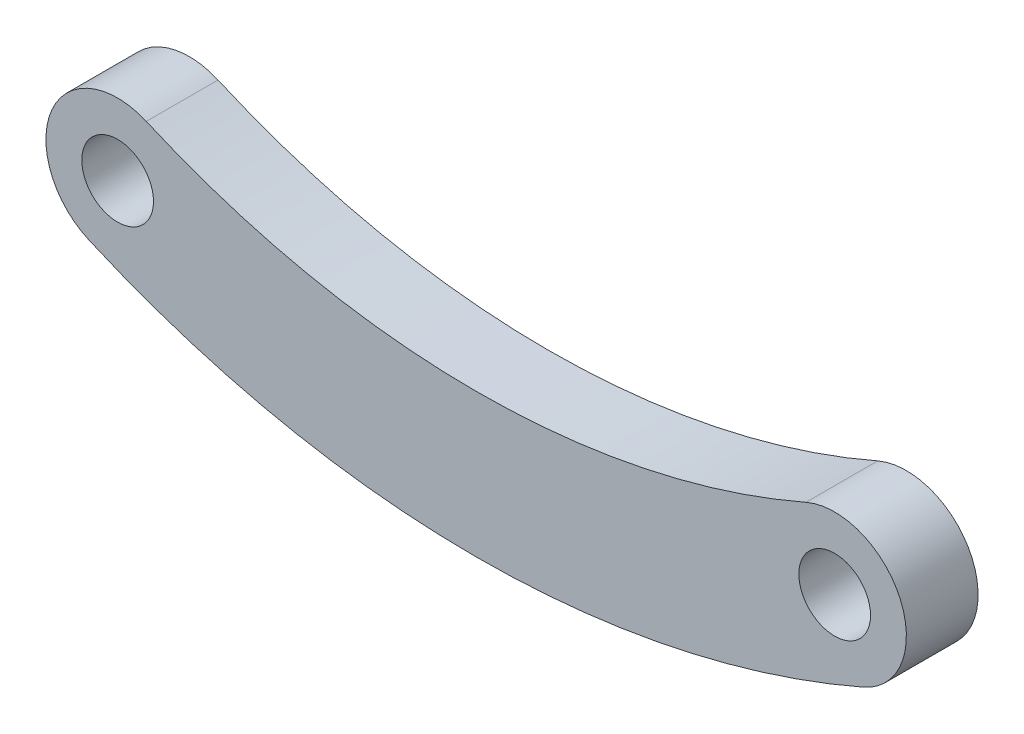
ISO-10303-21;
HEADER;
FILE_DESCRIPTION(('STEP AP214'),'2;1');
FILE_NAME('part.step','',(''),(''),'','','');
FILE_SCHEMA(('AUTOMOTIVE_DESIGN { 1 0 10303 214 1 1 1 1 }'));
ENDSEC;
DATA;
#1=APPLICATION_CONTEXT('core data for automotive mechanical design processes');
#2=APPLICATION_PROTOCOL_DEFINITION('international standard','automotive_design',2000,#1);
#3=PRODUCT_CONTEXT('',#1,'mechanical');
#4=PRODUCT('Part','Part','',(#3));
#5=PRODUCT_RELATED_PRODUCT_CATEGORY('part','',(#4));
#6=PRODUCT_DEFINITION_FORMATION('','',#4);
#7=PRODUCT_DEFINITION_CONTEXT('part definition',#1,'design');
#8=PRODUCT_DEFINITION('design','',#6,#7);
#9=PRODUCT_DEFINITION_SHAPE('','',#8);
#10=(LENGTH_UNIT() NAMED_UNIT(*) SI_UNIT(.MILLI.,.METRE.));
#11=(NAMED_UNIT(*) PLANE_ANGLE_UNIT() SI_UNIT($,.RADIAN.));
#12=(NAMED_UNIT(*) SI_UNIT($,.STERADIAN.) SOLID_ANGLE_UNIT());
#13=UNCERTAINTY_MEASURE_WITH_UNIT(LENGTH_MEASURE(1.E-05),#10,'distance_accuracy_value','');
#14=(GEOMETRIC_REPRESENTATION_CONTEXT(3) GLOBAL_UNCERTAINTY_ASSIGNED_CONTEXT((#13)) GLOBAL_UNIT_ASSIGNED_CONTEXT((#10,
#11,#12)) REPRESENTATION_CONTEXT('',''));
#15=CARTESIAN_POINT('',(0.,0.,0.));
#16=DIRECTION('',(0.,0.,1.));
#17=DIRECTION('',(1.,0.,0.));
#18=AXIS2_PLACEMENT_3D('',#15,#16,#17);
#19=CARTESIAN_POINT('',(10.0000000000001,22.9128784747793,4.));
#20=DIRECTION('',(0.,0.,-1.));
#21=DIRECTION('',(-1.,0.,0.));
#22=AXIS2_PLACEMENT_3D('',#19,#20,#21);
#23=PLANE('',#22);
#24=CARTESIAN_POINT('',(1.18123826692296E-13,2.4421653935236E-13,4.));
#25=DIRECTION('',(0.,0.,1.));
#26=DIRECTION('',(-1.,0.,0.));
#27=AXIS2_PLACEMENT_3D('',#24,#25,#26);
#28=CIRCLE('',#27,4.);
#29=CARTESIAN_POINT('',(1.59999999999996,3.66606055596469,4.));
#30=VERTEX_POINT('',#29);
#31=CARTESIAN_POINT('',(-1.60000000000001,-3.66606055596468,4.));
#32=VERTEX_POINT('',#31);
#33=EDGE_CURVE('E85',#30,#32,#28,.T.);
#34=ORIENTED_EDGE('',*,*,#33,.T.);
#35=CARTESIAN_POINT('',(20.,45.8257569495584,4.));
#36=DIRECTION('',(0.,0.,1.));
#37=DIRECTION('',(1.,0.,0.));
#38=AXIS2_PLACEMENT_3D('',#35,#36,#37);
#39=CIRCLE('',#38,54.);
#40=CARTESIAN_POINT('',(41.6,-3.66606055596468,4.));
#41=VERTEX_POINT('',#40);
#42=EDGE_CURVE('E80',#32,#41,#39,.T.);
#43=ORIENTED_EDGE('',*,*,#42,.T.);
#44=CARTESIAN_POINT('',(40.,0.,4.));
#45=DIRECTION('',(0.,0.,1.));
#46=DIRECTION('',(1.,0.,0.));
#47=AXIS2_PLACEMENT_3D('',#44,#45,#46);
#48=CIRCLE('',#47,4.00000000000001);
#49=CARTESIAN_POINT('',(38.4,3.66606055596467,4.));
#50=VERTEX_POINT('',#49);
#51=EDGE_CURVE('E83',#41,#50,#48,.T.);
#52=ORIENTED_EDGE('',*,*,#51,.T.);
#53=CARTESIAN_POINT('',(20.,45.8257569495584,4.));
#54=DIRECTION('',(0.,0.,-1.));
#55=DIRECTION('',(1.,0.,0.));
#56=AXIS2_PLACEMENT_3D('',#53,#54,#55);
#57=CIRCLE('',#56,46.);
#58=EDGE_CURVE('E50',#50,#30,#57,.T.);
#59=ORIENTED_EDGE('',*,*,#58,.T.);
#60=EDGE_LOOP('',(#34,#43,#52,#59));
#61=FACE_BOUND('',#60,.T.);
#62=CARTESIAN_POINT('',(0.,0.,4.));
#63=DIRECTION('',(0.,0.,1.));
#64=DIRECTION('',(1.,0.,0.));
#65=AXIS2_PLACEMENT_3D('',#62,#63,#64);
#66=CIRCLE('',#65,2.);
#67=CARTESIAN_POINT('',(2.,0.,4.));
#68=VERTEX_POINT('',#67);
#69=EDGE_CURVE('E100',#68,#68,#66,.T.);
#70=ORIENTED_EDGE('',*,*,#69,.F.);
#71=EDGE_LOOP('',(#70));
#72=FACE_BOUND('',#71,.T.);
#73=CARTESIAN_POINT('',(40.,0.,4.));
#74=DIRECTION('',(0.,0.,1.));
#75=DIRECTION('',(1.,0.,0.));
#76=AXIS2_PLACEMENT_3D('',#73,#74,#75);
#77=CIRCLE('',#76,2.);
#78=CARTESIAN_POINT('',(42.,0.,4.));
#79=VERTEX_POINT('',#78);
#80=EDGE_CURVE('E115',#79,#79,#77,.T.);
#81=ORIENTED_EDGE('',*,*,#80,.F.);
#82=EDGE_LOOP('',(#81));
#83=FACE_BOUND('',#82,.T.);
#84=ADVANCED_FACE('F33',(#61,#72,#83),#23,.F.);
#85=CARTESIAN_POINT('',(10.0000000000001,22.9128784747793,0.));
#86=DIRECTION('',(0.,0.,-1.));
#87=DIRECTION('',(-1.,0.,0.));
#88=AXIS2_PLACEMENT_3D('',#85,#86,#87);
#89=PLANE('',#88);
#90=CARTESIAN_POINT('',(0.,0.,0.));
#91=DIRECTION('',(0.,0.,1.));
#92=DIRECTION('',(1.,0.,0.));
#93=AXIS2_PLACEMENT_3D('',#90,#91,#92);
#94=CIRCLE('',#93,2.);
#95=CARTESIAN_POINT('',(2.,0.,0.));
#96=VERTEX_POINT('',#95);
#97=EDGE_CURVE('E112',#96,#96,#94,.T.);
#98=ORIENTED_EDGE('',*,*,#97,.T.);
#99=EDGE_LOOP('',(#98));
#100=FACE_BOUND('',#99,.T.);
#101=CARTESIAN_POINT('',(1.18123826692296E-13,2.4421653935236E-13,0.));
#102=DIRECTION('',(0.,0.,1.));
#103=DIRECTION('',(-1.,0.,0.));
#104=AXIS2_PLACEMENT_3D('',#101,#102,#103);
#105=CIRCLE('',#104,4.);
#106=CARTESIAN_POINT('',(1.59999999999996,3.66606055596469,0.));
#107=VERTEX_POINT('',#106);
#108=CARTESIAN_POINT('',(-1.60000000000001,-3.66606055596468,0.));
#109=VERTEX_POINT('',#108);
#110=EDGE_CURVE('E97',#107,#109,#105,.T.);
#111=ORIENTED_EDGE('',*,*,#110,.F.);
#112=CARTESIAN_POINT('',(20.,45.8257569495584,0.));
#113=DIRECTION('',(0.,0.,-1.));
#114=DIRECTION('',(1.,0.,0.));
#115=AXIS2_PLACEMENT_3D('',#112,#113,#114);
#116=CIRCLE('',#115,46.);
#117=CARTESIAN_POINT('',(38.4,3.66606055596467,0.));
#118=VERTEX_POINT('',#117);
#119=EDGE_CURVE('E73',#118,#107,#116,.T.);
#120=ORIENTED_EDGE('',*,*,#119,.F.);
#121=CARTESIAN_POINT('',(40.,0.,0.));
#122=DIRECTION('',(0.,0.,1.));
#123=DIRECTION('',(1.,0.,0.));
#124=AXIS2_PLACEMENT_3D('',#121,#122,#123);
#125=CIRCLE('',#124,4.00000000000001);
#126=CARTESIAN_POINT('',(41.6,-3.66606055596468,0.));
#127=VERTEX_POINT('',#126);
#128=EDGE_CURVE('E67',#127,#118,#125,.T.);
#129=ORIENTED_EDGE('',*,*,#128,.F.);
#130=CARTESIAN_POINT('',(20.,45.8257569495584,0.));
#131=DIRECTION('',(0.,0.,1.));
#132=DIRECTION('',(1.,0.,0.));
#133=AXIS2_PLACEMENT_3D('',#130,#131,#132);
#134=CIRCLE('',#133,54.);
#135=EDGE_CURVE('E89',#109,#127,#134,.T.);
#136=ORIENTED_EDGE('',*,*,#135,.F.);
#137=EDGE_LOOP('',(#111,#120,#129,#136));
#138=FACE_BOUND('',#137,.T.);
#139=CARTESIAN_POINT('',(40.,0.,0.));
#140=DIRECTION('',(0.,0.,1.));
#141=DIRECTION('',(1.,0.,0.));
#142=AXIS2_PLACEMENT_3D('',#139,#140,#141);
#143=CIRCLE('',#142,2.);
#144=CARTESIAN_POINT('',(42.,0.,0.));
#145=VERTEX_POINT('',#144);
#146=EDGE_CURVE('E118',#145,#145,#143,.T.);
#147=ORIENTED_EDGE('',*,*,#146,.T.);
#148=EDGE_LOOP('',(#147));
#149=FACE_BOUND('',#148,.T.);
#150=ADVANCED_FACE('F108',(#100,#138,#149),#89,.T.);
#151=CARTESIAN_POINT('',(1.18123826692296E-13,2.4421653935236E-13,4.));
#152=DIRECTION('',(0.,0.,-1.));
#153=DIRECTION('',(-1.,0.,0.));
#154=AXIS2_PLACEMENT_3D('',#151,#152,#153);
#155=CYLINDRICAL_SURFACE('',#154,4.);
#156=ORIENTED_EDGE('',*,*,#110,.T.);
#157=DIRECTION('',(0.,0.,-1.));
#158=VECTOR('',#157,1.);
#159=CARTESIAN_POINT('',(-1.60000000000001,-3.66606055596468,4.));
#160=LINE('',#159,#158);
#161=EDGE_CURVE('E11',#32,#109,#160,.T.);
#162=ORIENTED_EDGE('',*,*,#161,.F.);
#163=ORIENTED_EDGE('',*,*,#33,.F.);
#164=DIRECTION('',(0.,0.,-1.));
#165=VECTOR('',#164,1.);
#166=CARTESIAN_POINT('',(1.59999999999996,3.66606055596469,4.));
#167=LINE('',#166,#165);
#168=EDGE_CURVE('E93',#30,#107,#167,.T.);
#169=ORIENTED_EDGE('',*,*,#168,.T.);
#170=EDGE_LOOP('',(#156,#162,#163,#169));
#171=FACE_BOUND('',#170,.T.);
#172=ADVANCED_FACE('F35',(#171),#155,.T.);
#173=CARTESIAN_POINT('',(20.,45.8257569495584,4.));
#174=DIRECTION('',(0.,0.,-1.));
#175=DIRECTION('',(-1.,0.,0.));
#176=AXIS2_PLACEMENT_3D('',#173,#174,#175);
#177=CYLINDRICAL_SURFACE('',#176,54.);
#178=ORIENTED_EDGE('',*,*,#135,.T.);
#179=DIRECTION('',(0.,0.,-1.));
#180=VECTOR('',#179,1.);
#181=CARTESIAN_POINT('',(41.6,-3.66606055596468,4.));
#182=LINE('',#181,#180);
#183=EDGE_CURVE('E42',#41,#127,#182,.T.);
#184=ORIENTED_EDGE('',*,*,#183,.F.);
#185=ORIENTED_EDGE('',*,*,#42,.F.);
#186=ORIENTED_EDGE('',*,*,#161,.T.);
#187=EDGE_LOOP('',(#178,#184,#185,#186));
#188=FACE_BOUND('',#187,.T.);
#189=ADVANCED_FACE('F88',(#188),#177,.T.);
#190=CARTESIAN_POINT('',(40.,0.,4.));
#191=DIRECTION('',(0.,0.,-1.));
#192=DIRECTION('',(-1.,0.,0.));
#193=AXIS2_PLACEMENT_3D('',#190,#191,#192);
#194=CYLINDRICAL_SURFACE('',#193,4.00000000000001);
#195=ORIENTED_EDGE('',*,*,#128,.T.);
#196=DIRECTION('',(0.,0.,-1.));
#197=VECTOR('',#196,1.);
#198=CARTESIAN_POINT('',(38.4,3.66606055596467,4.));
#199=LINE('',#198,#197);
#200=EDGE_CURVE('E90',#50,#118,#199,.T.);
#201=ORIENTED_EDGE('',*,*,#200,.F.);
#202=ORIENTED_EDGE('',*,*,#51,.F.);
#203=ORIENTED_EDGE('',*,*,#183,.T.);
#204=EDGE_LOOP('',(#195,#201,#202,#203));
#205=FACE_BOUND('',#204,.T.);
#206=ADVANCED_FACE('F91',(#205),#194,.T.);
#207=CARTESIAN_POINT('',(20.,45.8257569495584,4.));
#208=DIRECTION('',(0.,0.,-1.));
#209=DIRECTION('',(-1.,0.,0.));
#210=AXIS2_PLACEMENT_3D('',#207,#208,#209);
#211=CYLINDRICAL_SURFACE('',#210,46.);
#212=ORIENTED_EDGE('',*,*,#119,.T.);
#213=ORIENTED_EDGE('',*,*,#168,.F.);
#214=ORIENTED_EDGE('',*,*,#58,.F.);
#215=ORIENTED_EDGE('',*,*,#200,.T.);
#216=EDGE_LOOP('',(#212,#213,#214,#215));
#217=FACE_BOUND('',#216,.T.);
#218=ADVANCED_FACE('F105',(#217),#211,.F.);
#219=CARTESIAN_POINT('',(0.,0.,4.));
#220=DIRECTION('',(0.,0.,-1.));
#221=DIRECTION('',(-1.,0.,0.));
#222=AXIS2_PLACEMENT_3D('',#219,#220,#221);
#223=CYLINDRICAL_SURFACE('',#222,2.);
#224=ORIENTED_EDGE('',*,*,#69,.T.);
#225=EDGE_LOOP('',(#224));
#226=FACE_BOUND('',#225,.T.);
#227=ORIENTED_EDGE('',*,*,#97,.F.);
#228=EDGE_LOOP('',(#227));
#229=FACE_BOUND('',#228,.T.);
#230=ADVANCED_FACE('F135',(#226,#229),#223,.F.);
#231=CARTESIAN_POINT('',(40.,0.,4.));
#232=DIRECTION('',(0.,0.,-1.));
#233=DIRECTION('',(-1.,0.,0.));
#234=AXIS2_PLACEMENT_3D('',#231,#232,#233);
#235=CYLINDRICAL_SURFACE('',#234,2.);
#236=ORIENTED_EDGE('',*,*,#80,.T.);
#237=EDGE_LOOP('',(#236));
#238=FACE_BOUND('',#237,.T.);
#239=ORIENTED_EDGE('',*,*,#146,.F.);
#240=EDGE_LOOP('',(#239));
#241=FACE_BOUND('',#240,.T.);
#242=ADVANCED_FACE('F124',(#238,#241),#235,.F.);
#243=CLOSED_SHELL('',(#84,#150,#172,#189,#206,#218,#230,#242));
#244=MANIFOLD_SOLID_BREP('B2',#243);
#245=ADVANCED_BREP_SHAPE_REPRESENTATION('',(#18,#244),#14);
#246=SHAPE_DEFINITION_REPRESENTATION(#9,#245);
ENDSEC;
END-ISO-10303-21;
